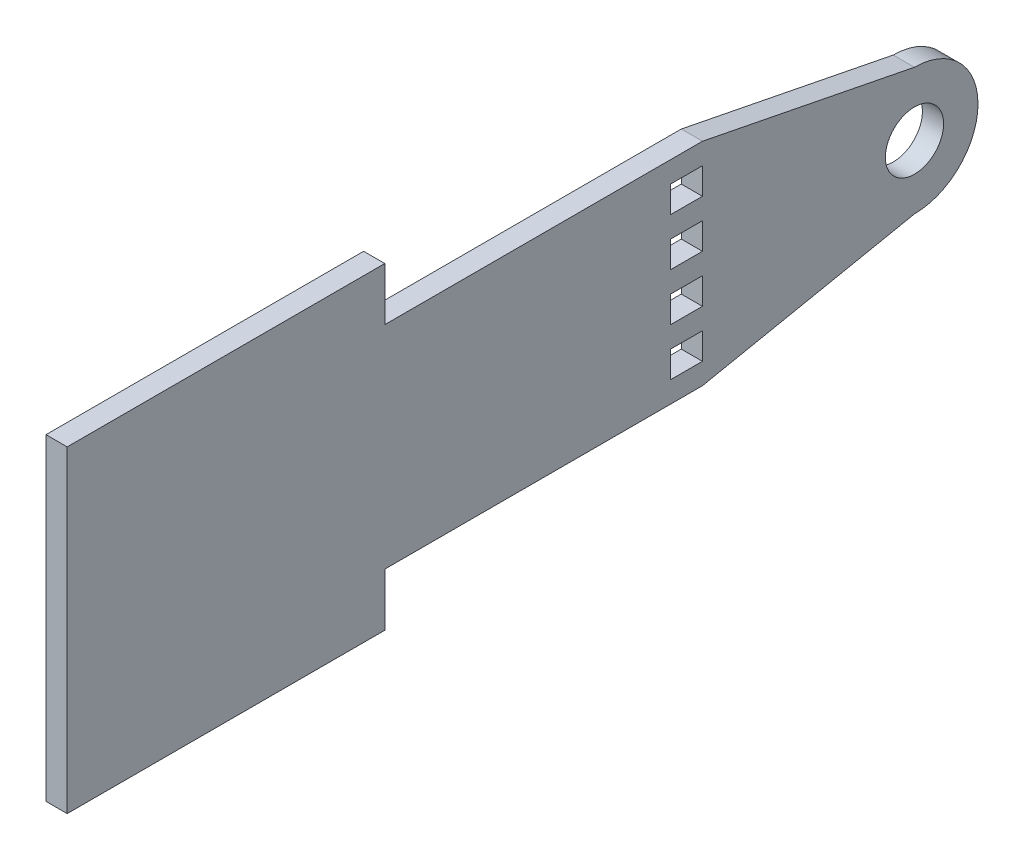
ISO-10303-21;
HEADER;
FILE_DESCRIPTION(('STEP AP214'),'2;1');
FILE_NAME('part.step','',(''),(''),'','','');
FILE_SCHEMA(('AUTOMOTIVE_DESIGN { 1 0 10303 214 1 1 1 1 }'));
ENDSEC;
DATA;
#1=APPLICATION_CONTEXT('core data for automotive mechanical design processes');
#2=APPLICATION_PROTOCOL_DEFINITION('international standard','automotive_design',2000,#1);
#3=PRODUCT_CONTEXT('',#1,'mechanical');
#4=PRODUCT('Part','Part','',(#3));
#5=PRODUCT_RELATED_PRODUCT_CATEGORY('part','',(#4));
#6=PRODUCT_DEFINITION_FORMATION('','',#4);
#7=PRODUCT_DEFINITION_CONTEXT('part definition',#1,'design');
#8=PRODUCT_DEFINITION('design','',#6,#7);
#9=PRODUCT_DEFINITION_SHAPE('','',#8);
#10=(LENGTH_UNIT() NAMED_UNIT(*) SI_UNIT(.MILLI.,.METRE.));
#11=(NAMED_UNIT(*) PLANE_ANGLE_UNIT() SI_UNIT($,.RADIAN.));
#12=(NAMED_UNIT(*) SI_UNIT($,.STERADIAN.) SOLID_ANGLE_UNIT());
#13=UNCERTAINTY_MEASURE_WITH_UNIT(LENGTH_MEASURE(1.E-05),#10,'distance_accuracy_value','');
#14=(GEOMETRIC_REPRESENTATION_CONTEXT(3) GLOBAL_UNCERTAINTY_ASSIGNED_CONTEXT((#13)) GLOBAL_UNIT_ASSIGNED_CONTEXT((#10,
#11,#12)) REPRESENTATION_CONTEXT('',''));
#15=CARTESIAN_POINT('',(0.,0.,0.));
#16=DIRECTION('',(0.,0.,1.));
#17=DIRECTION('',(1.,0.,0.));
#18=AXIS2_PLACEMENT_3D('',#15,#16,#17);
#19=CARTESIAN_POINT('',(2.,0.0415723815960552,-50.0283058298297));
#20=DIRECTION('',(1.,0.,0.));
#21=DIRECTION('',(0.,0.,-1.));
#22=AXIS2_PLACEMENT_3D('',#19,#20,#21);
#23=PLANE('',#22);
#24=DIRECTION('',(0.,0.,1.));
#25=VECTOR('',#24,1.);
#26=CARTESIAN_POINT('',(2.,8.,-27.));
#27=LINE('',#26,#25);
#28=CARTESIAN_POINT('',(2.,8.,-30.));
#29=VERTEX_POINT('',#28);
#30=CARTESIAN_POINT('',(2.,8.,-27.));
#31=VERTEX_POINT('',#30);
#32=EDGE_CURVE('E214',#29,#31,#27,.T.);
#33=ORIENTED_EDGE('',*,*,#32,.F.);
#34=DIRECTION('',(0.,1.,0.));
#35=VECTOR('',#34,1.);
#36=CARTESIAN_POINT('',(2.,8.,-30.));
#37=LINE('',#36,#35);
#38=CARTESIAN_POINT('',(2.,5.50000000000001,-30.));
#39=VERTEX_POINT('',#38);
#40=EDGE_CURVE('E206',#39,#29,#37,.T.);
#41=ORIENTED_EDGE('',*,*,#40,.F.);
#42=DIRECTION('',(0.,0.,-1.));
#43=VECTOR('',#42,1.);
#44=CARTESIAN_POINT('',(2.,5.50000000000001,-30.));
#45=LINE('',#44,#43);
#46=CARTESIAN_POINT('',(2.,5.5,-27.));
#47=VERTEX_POINT('',#46);
#48=EDGE_CURVE('E229',#47,#39,#45,.T.);
#49=ORIENTED_EDGE('',*,*,#48,.F.);
#50=DIRECTION('',(0.,-1.,0.));
#51=VECTOR('',#50,1.);
#52=CARTESIAN_POINT('',(2.,5.5,-27.));
#53=LINE('',#52,#51);
#54=EDGE_CURVE('E227',#31,#47,#53,.T.);
#55=ORIENTED_EDGE('',*,*,#54,.F.);
#56=EDGE_LOOP('',(#33,#41,#49,#55));
#57=FACE_BOUND('',#56,.T.);
#58=DIRECTION('',(0.,0.,1.));
#59=VECTOR('',#58,1.);
#60=CARTESIAN_POINT('',(2.,3.5,-27.));
#61=LINE('',#60,#59);
#62=CARTESIAN_POINT('',(2.,3.5,-30.));
#63=VERTEX_POINT('',#62);
#64=CARTESIAN_POINT('',(2.,3.5,-27.));
#65=VERTEX_POINT('',#64);
#66=EDGE_CURVE('E247',#63,#65,#61,.T.);
#67=ORIENTED_EDGE('',*,*,#66,.F.);
#68=DIRECTION('',(0.,1.,0.));
#69=VECTOR('',#68,1.);
#70=CARTESIAN_POINT('',(2.,3.5,-30.));
#71=LINE('',#70,#69);
#72=CARTESIAN_POINT('',(2.,1.,-30.));
#73=VERTEX_POINT('',#72);
#74=EDGE_CURVE('E245',#73,#63,#71,.T.);
#75=ORIENTED_EDGE('',*,*,#74,.F.);
#76=DIRECTION('',(0.,0.,-1.));
#77=VECTOR('',#76,1.);
#78=CARTESIAN_POINT('',(2.,1.,-30.));
#79=LINE('',#78,#77);
#80=CARTESIAN_POINT('',(2.,1.,-27.));
#81=VERTEX_POINT('',#80);
#82=EDGE_CURVE('E253',#81,#73,#79,.T.);
#83=ORIENTED_EDGE('',*,*,#82,.F.);
#84=DIRECTION('',(0.,-1.,0.));
#85=VECTOR('',#84,1.);
#86=CARTESIAN_POINT('',(2.,1.,-27.));
#87=LINE('',#86,#85);
#88=EDGE_CURVE('E250',#65,#81,#87,.T.);
#89=ORIENTED_EDGE('',*,*,#88,.F.);
#90=EDGE_LOOP('',(#67,#75,#83,#89));
#91=FACE_BOUND('',#90,.T.);
#92=DIRECTION('',(0.,0.,1.));
#93=VECTOR('',#92,1.);
#94=CARTESIAN_POINT('',(2.,-1.,-27.));
#95=LINE('',#94,#93);
#96=CARTESIAN_POINT('',(2.,-1.,-30.));
#97=VERTEX_POINT('',#96);
#98=CARTESIAN_POINT('',(2.,-1.,-27.));
#99=VERTEX_POINT('',#98);
#100=EDGE_CURVE('E278',#97,#99,#95,.T.);
#101=ORIENTED_EDGE('',*,*,#100,.F.);
#102=DIRECTION('',(0.,1.,0.));
#103=VECTOR('',#102,1.);
#104=CARTESIAN_POINT('',(2.,-1.,-30.));
#105=LINE('',#104,#103);
#106=CARTESIAN_POINT('',(2.,-3.5,-30.));
#107=VERTEX_POINT('',#106);
#108=EDGE_CURVE('E276',#107,#97,#105,.T.);
#109=ORIENTED_EDGE('',*,*,#108,.F.);
#110=DIRECTION('',(0.,0.,-1.));
#111=VECTOR('',#110,1.);
#112=CARTESIAN_POINT('',(2.,-3.5,-30.));
#113=LINE('',#112,#111);
#114=CARTESIAN_POINT('',(2.,-3.5,-27.));
#115=VERTEX_POINT('',#114);
#116=EDGE_CURVE('E284',#115,#107,#113,.T.);
#117=ORIENTED_EDGE('',*,*,#116,.F.);
#118=DIRECTION('',(0.,-1.,0.));
#119=VECTOR('',#118,1.);
#120=CARTESIAN_POINT('',(2.,-3.5,-27.));
#121=LINE('',#120,#119);
#122=EDGE_CURVE('E281',#99,#115,#121,.T.);
#123=ORIENTED_EDGE('',*,*,#122,.F.);
#124=EDGE_LOOP('',(#101,#109,#117,#123));
#125=FACE_BOUND('',#124,.T.);
#126=DIRECTION('',(0.,1.,0.));
#127=VECTOR('',#126,1.);
#128=CARTESIAN_POINT('',(2.,-5.5,-30.));
#129=LINE('',#128,#127);
#130=CARTESIAN_POINT('',(2.,-8.,-30.));
#131=VERTEX_POINT('',#130);
#132=CARTESIAN_POINT('',(2.,-5.5,-30.));
#133=VERTEX_POINT('',#132);
#134=EDGE_CURVE('E309',#131,#133,#129,.T.);
#135=ORIENTED_EDGE('',*,*,#134,.F.);
#136=DIRECTION('',(0.,0.,-1.));
#137=VECTOR('',#136,1.);
#138=CARTESIAN_POINT('',(2.,-8.,-30.));
#139=LINE('',#138,#137);
#140=CARTESIAN_POINT('',(2.,-8.,-27.));
#141=VERTEX_POINT('',#140);
#142=EDGE_CURVE('E307',#141,#131,#139,.T.);
#143=ORIENTED_EDGE('',*,*,#142,.F.);
#144=DIRECTION('',(0.,-1.,0.));
#145=VECTOR('',#144,1.);
#146=CARTESIAN_POINT('',(2.,-8.,-27.));
#147=LINE('',#146,#145);
#148=CARTESIAN_POINT('',(2.,-5.5,-27.));
#149=VERTEX_POINT('',#148);
#150=EDGE_CURVE('E315',#149,#141,#147,.T.);
#151=ORIENTED_EDGE('',*,*,#150,.F.);
#152=DIRECTION('',(0.,0.,1.));
#153=VECTOR('',#152,1.);
#154=CARTESIAN_POINT('',(2.,-5.5,-27.));
#155=LINE('',#154,#153);
#156=EDGE_CURVE('E312',#133,#149,#155,.T.);
#157=ORIENTED_EDGE('',*,*,#156,.F.);
#158=EDGE_LOOP('',(#135,#143,#151,#157));
#159=FACE_BOUND('',#158,.T.);
#160=DIRECTION('',(0.,0.19389102891335,0.981023072566044));
#161=VECTOR('',#160,1.);
#162=CARTESIAN_POINT('',(2.,6.04157238159606,-50.0283058298297));
#163=LINE('',#162,#161);
#164=CARTESIAN_POINT('',(2.,6.04157238159606,-50.0283058298297));
#165=VERTEX_POINT('',#164);
#166=CARTESIAN_POINT('',(2.,10.,-30.));
#167=VERTEX_POINT('',#166);
#168=EDGE_CURVE('E338',#165,#167,#163,.T.);
#169=ORIENTED_EDGE('',*,*,#168,.T.);
#170=DIRECTION('',(0.,0.,1.));
#171=VECTOR('',#170,1.);
#172=CARTESIAN_POINT('',(2.,10.,-30.));
#173=LINE('',#172,#171);
#174=CARTESIAN_POINT('',(2.,10.,0.));
#175=VERTEX_POINT('',#174);
#176=EDGE_CURVE('E341',#167,#175,#173,.T.);
#177=ORIENTED_EDGE('',*,*,#176,.T.);
#178=DIRECTION('',(0.,1.,0.));
#179=VECTOR('',#178,1.);
#180=CARTESIAN_POINT('',(2.,10.,0.));
#181=LINE('',#180,#179);
#182=CARTESIAN_POINT('',(2.,15.,0.));
#183=VERTEX_POINT('',#182);
#184=EDGE_CURVE('E344',#175,#183,#181,.T.);
#185=ORIENTED_EDGE('',*,*,#184,.T.);
#186=DIRECTION('',(0.,0.,1.));
#187=VECTOR('',#186,1.);
#188=CARTESIAN_POINT('',(2.,15.,0.));
#189=LINE('',#188,#187);
#190=CARTESIAN_POINT('',(2.,15.,30.));
#191=VERTEX_POINT('',#190);
#192=EDGE_CURVE('E346',#183,#191,#189,.T.);
#193=ORIENTED_EDGE('',*,*,#192,.T.);
#194=DIRECTION('',(0.,-1.,0.));
#195=VECTOR('',#194,1.);
#196=CARTESIAN_POINT('',(2.,15.,30.));
#197=LINE('',#196,#195);
#198=CARTESIAN_POINT('',(2.,-15.,30.));
#199=VERTEX_POINT('',#198);
#200=EDGE_CURVE('E348',#191,#199,#197,.T.);
#201=ORIENTED_EDGE('',*,*,#200,.T.);
#202=DIRECTION('',(0.,0.,-1.));
#203=VECTOR('',#202,1.);
#204=CARTESIAN_POINT('',(2.,-15.,30.));
#205=LINE('',#204,#203);
#206=CARTESIAN_POINT('',(2.,-15.,0.));
#207=VERTEX_POINT('',#206);
#208=EDGE_CURVE('E350',#199,#207,#205,.T.);
#209=ORIENTED_EDGE('',*,*,#208,.T.);
#210=DIRECTION('',(0.,1.,0.));
#211=VECTOR('',#210,1.);
#212=CARTESIAN_POINT('',(2.,-15.,0.));
#213=LINE('',#212,#211);
#214=CARTESIAN_POINT('',(2.,-10.,0.));
#215=VERTEX_POINT('',#214);
#216=EDGE_CURVE('E352',#207,#215,#213,.T.);
#217=ORIENTED_EDGE('',*,*,#216,.T.);
#218=DIRECTION('',(0.,0.,-1.));
#219=VECTOR('',#218,1.);
#220=CARTESIAN_POINT('',(2.,-10.,0.));
#221=LINE('',#220,#219);
#222=CARTESIAN_POINT('',(2.,-10.,-30.));
#223=VERTEX_POINT('',#222);
#224=EDGE_CURVE('E354',#215,#223,#221,.T.);
#225=ORIENTED_EDGE('',*,*,#224,.T.);
#226=DIRECTION('',(0.,0.197805839240745,-0.980241220293385));
#227=VECTOR('',#226,1.);
#228=CARTESIAN_POINT('',(2.,-5.95842761840395,-50.0283058298297));
#229=LINE('',#228,#227);
#230=CARTESIAN_POINT('',(2.,-5.95842761840395,-50.0283058298297));
#231=VERTEX_POINT('',#230);
#232=EDGE_CURVE('E356',#223,#231,#229,.T.);
#233=ORIENTED_EDGE('',*,*,#232,.T.);
#234=CARTESIAN_POINT('',(2.,0.0415723815960552,-50.0283058298297));
#235=DIRECTION('',(1.,0.,0.));
#236=DIRECTION('',(0.,0.,-1.));
#237=AXIS2_PLACEMENT_3D('',#234,#235,#236);
#238=CIRCLE('',#237,6.);
#239=EDGE_CURVE('E358',#231,#165,#238,.T.);
#240=ORIENTED_EDGE('',*,*,#239,.T.);
#241=EDGE_LOOP('',(#169,#177,#185,#193,#201,#209,#217,#225,#233,#240));
#242=FACE_BOUND('',#241,.T.);
#243=CARTESIAN_POINT('',(2.,0.0415723815960552,-50.0283058298297));
#244=DIRECTION('',(1.,0.,0.));
#245=DIRECTION('',(0.,0.,-1.));
#246=AXIS2_PLACEMENT_3D('',#243,#244,#245);
#247=CIRCLE('',#246,2.75);
#248=CARTESIAN_POINT('',(2.,0.0415723815960552,-52.7783058298297));
#249=VERTEX_POINT('',#248);
#250=EDGE_CURVE('E235',#249,#249,#247,.T.);
#251=ORIENTED_EDGE('',*,*,#250,.F.);
#252=EDGE_LOOP('',(#251));
#253=FACE_BOUND('',#252,.T.);
#254=ADVANCED_FACE('F33',(#57,#91,#125,#159,#242,#253),#23,.T.);
#255=CARTESIAN_POINT('',(0.,0.0415723815960552,-50.0283058298297));
#256=DIRECTION('',(1.,0.,0.));
#257=DIRECTION('',(0.,0.,-1.));
#258=AXIS2_PLACEMENT_3D('',#255,#256,#257);
#259=PLANE('',#258);
#260=DIRECTION('',(0.,1.,0.));
#261=VECTOR('',#260,1.);
#262=CARTESIAN_POINT('',(0.,3.5,-30.));
#263=LINE('',#262,#261);
#264=CARTESIAN_POINT('',(0.,1.,-30.));
#265=VERTEX_POINT('',#264);
#266=CARTESIAN_POINT('',(0.,3.5,-30.));
#267=VERTEX_POINT('',#266);
#268=EDGE_CURVE('E222',#265,#267,#263,.T.);
#269=ORIENTED_EDGE('',*,*,#268,.T.);
#270=DIRECTION('',(0.,0.,1.));
#271=VECTOR('',#270,1.);
#272=CARTESIAN_POINT('',(0.,3.5,-27.));
#273=LINE('',#272,#271);
#274=CARTESIAN_POINT('',(0.,3.5,-27.));
#275=VERTEX_POINT('',#274);
#276=EDGE_CURVE('E258',#267,#275,#273,.T.);
#277=ORIENTED_EDGE('',*,*,#276,.T.);
#278=DIRECTION('',(0.,-1.,0.));
#279=VECTOR('',#278,1.);
#280=CARTESIAN_POINT('',(0.,1.,-27.));
#281=LINE('',#280,#279);
#282=CARTESIAN_POINT('',(0.,1.,-27.));
#283=VERTEX_POINT('',#282);
#284=EDGE_CURVE('E261',#275,#283,#281,.T.);
#285=ORIENTED_EDGE('',*,*,#284,.T.);
#286=DIRECTION('',(0.,0.,-1.));
#287=VECTOR('',#286,1.);
#288=CARTESIAN_POINT('',(0.,1.,-30.));
#289=LINE('',#288,#287);
#290=EDGE_CURVE('E248',#283,#265,#289,.T.);
#291=ORIENTED_EDGE('',*,*,#290,.T.);
#292=EDGE_LOOP('',(#269,#277,#285,#291));
#293=FACE_BOUND('',#292,.T.);
#294=DIRECTION('',(0.,0.,-1.));
#295=VECTOR('',#294,1.);
#296=CARTESIAN_POINT('',(0.,-8.,-30.));
#297=LINE('',#296,#295);
#298=CARTESIAN_POINT('',(0.,-8.,-27.));
#299=VERTEX_POINT('',#298);
#300=CARTESIAN_POINT('',(0.,-8.,-30.));
#301=VERTEX_POINT('',#300);
#302=EDGE_CURVE('E306',#299,#301,#297,.T.);
#303=ORIENTED_EDGE('',*,*,#302,.T.);
#304=DIRECTION('',(0.,1.,0.));
#305=VECTOR('',#304,1.);
#306=CARTESIAN_POINT('',(0.,-5.5,-30.));
#307=LINE('',#306,#305);
#308=CARTESIAN_POINT('',(0.,-5.5,-30.));
#309=VERTEX_POINT('',#308);
#310=EDGE_CURVE('E320',#301,#309,#307,.T.);
#311=ORIENTED_EDGE('',*,*,#310,.T.);
#312=DIRECTION('',(0.,0.,1.));
#313=VECTOR('',#312,1.);
#314=CARTESIAN_POINT('',(0.,-5.5,-27.));
#315=LINE('',#314,#313);
#316=CARTESIAN_POINT('',(0.,-5.5,-27.));
#317=VERTEX_POINT('',#316);
#318=EDGE_CURVE('E323',#309,#317,#315,.T.);
#319=ORIENTED_EDGE('',*,*,#318,.T.);
#320=DIRECTION('',(0.,-1.,0.));
#321=VECTOR('',#320,1.);
#322=CARTESIAN_POINT('',(0.,-8.,-27.));
#323=LINE('',#322,#321);
#324=EDGE_CURVE('E310',#317,#299,#323,.T.);
#325=ORIENTED_EDGE('',*,*,#324,.T.);
#326=EDGE_LOOP('',(#303,#311,#319,#325));
#327=FACE_BOUND('',#326,.T.);
#328=DIRECTION('',(0.,0.19389102891335,0.981023072566044));
#329=VECTOR('',#328,1.);
#330=CARTESIAN_POINT('',(0.,6.04157238159606,-50.0283058298297));
#331=LINE('',#330,#329);
#332=CARTESIAN_POINT('',(0.,6.04157238159606,-50.0283058298297));
#333=VERTEX_POINT('',#332);
#334=CARTESIAN_POINT('',(0.,10.,-30.));
#335=VERTEX_POINT('',#334);
#336=EDGE_CURVE('E337',#333,#335,#331,.T.);
#337=ORIENTED_EDGE('',*,*,#336,.F.);
#338=CARTESIAN_POINT('',(0.,0.0415723815960552,-50.0283058298297));
#339=DIRECTION('',(1.,0.,0.));
#340=DIRECTION('',(0.,0.,-1.));
#341=AXIS2_PLACEMENT_3D('',#338,#339,#340);
#342=CIRCLE('',#341,6.);
#343=CARTESIAN_POINT('',(0.,-5.95842761840395,-50.0283058298297));
#344=VERTEX_POINT('',#343);
#345=EDGE_CURVE('E342',#344,#333,#342,.T.);
#346=ORIENTED_EDGE('',*,*,#345,.F.);
#347=DIRECTION('',(0.,0.197805839240745,-0.980241220293385));
#348=VECTOR('',#347,1.);
#349=CARTESIAN_POINT('',(0.,-5.95842761840395,-50.0283058298297));
#350=LINE('',#349,#348);
#351=CARTESIAN_POINT('',(0.,-10.,-30.));
#352=VERTEX_POINT('',#351);
#353=EDGE_CURVE('E377',#352,#344,#350,.T.);
#354=ORIENTED_EDGE('',*,*,#353,.F.);
#355=DIRECTION('',(0.,0.,-1.));
#356=VECTOR('',#355,1.);
#357=CARTESIAN_POINT('',(0.,-10.,0.));
#358=LINE('',#357,#356);
#359=CARTESIAN_POINT('',(0.,-10.,0.));
#360=VERTEX_POINT('',#359);
#361=EDGE_CURVE('E375',#360,#352,#358,.T.);
#362=ORIENTED_EDGE('',*,*,#361,.F.);
#363=DIRECTION('',(0.,1.,0.));
#364=VECTOR('',#363,1.);
#365=CARTESIAN_POINT('',(0.,-15.,0.));
#366=LINE('',#365,#364);
#367=CARTESIAN_POINT('',(0.,-15.,0.));
#368=VERTEX_POINT('',#367);
#369=EDGE_CURVE('E373',#368,#360,#366,.T.);
#370=ORIENTED_EDGE('',*,*,#369,.F.);
#371=DIRECTION('',(0.,0.,-1.));
#372=VECTOR('',#371,1.);
#373=CARTESIAN_POINT('',(0.,-15.,30.));
#374=LINE('',#373,#372);
#375=CARTESIAN_POINT('',(0.,-15.,30.));
#376=VERTEX_POINT('',#375);
#377=EDGE_CURVE('E371',#376,#368,#374,.T.);
#378=ORIENTED_EDGE('',*,*,#377,.F.);
#379=DIRECTION('',(0.,-1.,0.));
#380=VECTOR('',#379,1.);
#381=CARTESIAN_POINT('',(0.,15.,30.));
#382=LINE('',#381,#380);
#383=CARTESIAN_POINT('',(0.,15.,30.));
#384=VERTEX_POINT('',#383);
#385=EDGE_CURVE('E369',#384,#376,#382,.T.);
#386=ORIENTED_EDGE('',*,*,#385,.F.);
#387=DIRECTION('',(0.,0.,1.));
#388=VECTOR('',#387,1.);
#389=CARTESIAN_POINT('',(0.,15.,0.));
#390=LINE('',#389,#388);
#391=CARTESIAN_POINT('',(0.,15.,0.));
#392=VERTEX_POINT('',#391);
#393=EDGE_CURVE('E367',#392,#384,#390,.T.);
#394=ORIENTED_EDGE('',*,*,#393,.F.);
#395=DIRECTION('',(0.,1.,0.));
#396=VECTOR('',#395,1.);
#397=CARTESIAN_POINT('',(0.,10.,0.));
#398=LINE('',#397,#396);
#399=CARTESIAN_POINT('',(0.,10.,0.));
#400=VERTEX_POINT('',#399);
#401=EDGE_CURVE('E365',#400,#392,#398,.T.);
#402=ORIENTED_EDGE('',*,*,#401,.F.);
#403=DIRECTION('',(0.,0.,1.));
#404=VECTOR('',#403,1.);
#405=CARTESIAN_POINT('',(0.,10.,-30.));
#406=LINE('',#405,#404);
#407=EDGE_CURVE('E363',#335,#400,#406,.T.);
#408=ORIENTED_EDGE('',*,*,#407,.F.);
#409=EDGE_LOOP('',(#337,#346,#354,#362,#370,#378,#386,#394,#402,#408));
#410=FACE_BOUND('',#409,.T.);
#411=DIRECTION('',(0.,1.,0.));
#412=VECTOR('',#411,1.);
#413=CARTESIAN_POINT('',(0.,-1.,-30.));
#414=LINE('',#413,#412);
#415=CARTESIAN_POINT('',(0.,-3.5,-30.));
#416=VERTEX_POINT('',#415);
#417=CARTESIAN_POINT('',(0.,-1.,-30.));
#418=VERTEX_POINT('',#417);
#419=EDGE_CURVE('E275',#416,#418,#414,.T.);
#420=ORIENTED_EDGE('',*,*,#419,.T.);
#421=DIRECTION('',(0.,0.,1.));
#422=VECTOR('',#421,1.);
#423=CARTESIAN_POINT('',(0.,-1.,-27.));
#424=LINE('',#423,#422);
#425=CARTESIAN_POINT('',(0.,-1.,-27.));
#426=VERTEX_POINT('',#425);
#427=EDGE_CURVE('E289',#418,#426,#424,.T.);
#428=ORIENTED_EDGE('',*,*,#427,.T.);
#429=DIRECTION('',(0.,-1.,0.));
#430=VECTOR('',#429,1.);
#431=CARTESIAN_POINT('',(0.,-3.5,-27.));
#432=LINE('',#431,#430);
#433=CARTESIAN_POINT('',(0.,-3.5,-27.));
#434=VERTEX_POINT('',#433);
#435=EDGE_CURVE('E292',#426,#434,#432,.T.);
#436=ORIENTED_EDGE('',*,*,#435,.T.);
#437=DIRECTION('',(0.,0.,-1.));
#438=VECTOR('',#437,1.);
#439=CARTESIAN_POINT('',(0.,-3.5,-30.));
#440=LINE('',#439,#438);
#441=EDGE_CURVE('E279',#434,#416,#440,.T.);
#442=ORIENTED_EDGE('',*,*,#441,.T.);
#443=EDGE_LOOP('',(#420,#428,#436,#442));
#444=FACE_BOUND('',#443,.T.);
#445=DIRECTION('',(0.,1.,0.));
#446=VECTOR('',#445,1.);
#447=CARTESIAN_POINT('',(0.,8.,-30.));
#448=LINE('',#447,#446);
#449=CARTESIAN_POINT('',(0.,5.50000000000001,-30.));
#450=VERTEX_POINT('',#449);
#451=CARTESIAN_POINT('',(0.,8.,-30.));
#452=VERTEX_POINT('',#451);
#453=EDGE_CURVE('E56',#450,#452,#448,.T.);
#454=ORIENTED_EDGE('',*,*,#453,.T.);
#455=DIRECTION('',(0.,0.,1.));
#456=VECTOR('',#455,1.);
#457=CARTESIAN_POINT('',(0.,8.,-27.));
#458=LINE('',#457,#456);
#459=CARTESIAN_POINT('',(0.,8.,-27.));
#460=VERTEX_POINT('',#459);
#461=EDGE_CURVE('E221',#452,#460,#458,.T.);
#462=ORIENTED_EDGE('',*,*,#461,.T.);
#463=DIRECTION('',(0.,-1.,0.));
#464=VECTOR('',#463,1.);
#465=CARTESIAN_POINT('',(0.,5.5,-27.));
#466=LINE('',#465,#464);
#467=CARTESIAN_POINT('',(0.,5.5,-27.));
#468=VERTEX_POINT('',#467);
#469=EDGE_CURVE('E237',#460,#468,#466,.T.);
#470=ORIENTED_EDGE('',*,*,#469,.T.);
#471=DIRECTION('',(0.,0.,-1.));
#472=VECTOR('',#471,1.);
#473=CARTESIAN_POINT('',(0.,5.50000000000001,-30.));
#474=LINE('',#473,#472);
#475=EDGE_CURVE('E215',#468,#450,#474,.T.);
#476=ORIENTED_EDGE('',*,*,#475,.T.);
#477=EDGE_LOOP('',(#454,#462,#470,#476));
#478=FACE_BOUND('',#477,.T.);
#479=CARTESIAN_POINT('',(0.,0.0415723815960552,-50.0283058298297));
#480=DIRECTION('',(1.,0.,0.));
#481=DIRECTION('',(0.,0.,-1.));
#482=AXIS2_PLACEMENT_3D('',#479,#480,#481);
#483=CIRCLE('',#482,2.75);
#484=CARTESIAN_POINT('',(0.,0.0415723815960552,-52.7783058298297));
#485=VERTEX_POINT('',#484);
#486=EDGE_CURVE('E720',#485,#485,#483,.T.);
#487=ORIENTED_EDGE('',*,*,#486,.T.);
#488=EDGE_LOOP('',(#487));
#489=FACE_BOUND('',#488,.T.);
#490=ADVANCED_FACE('F413',(#293,#327,#410,#444,#478,#489),#259,.F.);
#491=CARTESIAN_POINT('',(2.,6.04157238159606,-50.0283058298297));
#492=DIRECTION('',(0.,-0.981023072566044,0.19389102891335));
#493=DIRECTION('',(0.,-0.19389102891335,-0.981023072566044));
#494=AXIS2_PLACEMENT_3D('',#491,#492,#493);
#495=PLANE('',#494);
#496=ORIENTED_EDGE('',*,*,#336,.T.);
#497=DIRECTION('',(-1.,0.,0.));
#498=VECTOR('',#497,1.);
#499=CARTESIAN_POINT('',(2.,10.,-30.));
#500=LINE('',#499,#498);
#501=EDGE_CURVE('E11',#167,#335,#500,.T.);
#502=ORIENTED_EDGE('',*,*,#501,.F.);
#503=ORIENTED_EDGE('',*,*,#168,.F.);
#504=DIRECTION('',(-1.,0.,0.));
#505=VECTOR('',#504,1.);
#506=CARTESIAN_POINT('',(2.,6.04157238159606,-50.0283058298297));
#507=LINE('',#506,#505);
#508=EDGE_CURVE('E360',#165,#333,#507,.T.);
#509=ORIENTED_EDGE('',*,*,#508,.T.);
#510=EDGE_LOOP('',(#496,#502,#503,#509));
#511=FACE_BOUND('',#510,.T.);
#512=ADVANCED_FACE('F35',(#511),#495,.F.);
#513=CARTESIAN_POINT('',(2.,10.,-30.));
#514=DIRECTION('',(0.,-1.,0.));
#515=DIRECTION('',(0.,0.,-1.));
#516=AXIS2_PLACEMENT_3D('',#513,#514,#515);
#517=PLANE('',#516);
#518=ORIENTED_EDGE('',*,*,#407,.T.);
#519=DIRECTION('',(-1.,0.,0.));
#520=VECTOR('',#519,1.);
#521=CARTESIAN_POINT('',(2.,10.,0.));
#522=LINE('',#521,#520);
#523=EDGE_CURVE('E41',#175,#400,#522,.T.);
#524=ORIENTED_EDGE('',*,*,#523,.F.);
#525=ORIENTED_EDGE('',*,*,#176,.F.);
#526=ORIENTED_EDGE('',*,*,#501,.T.);
#527=EDGE_LOOP('',(#518,#524,#525,#526));
#528=FACE_BOUND('',#527,.T.);
#529=ADVANCED_FACE('F431',(#528),#517,.F.);
#530=CARTESIAN_POINT('',(2.,10.,0.));
#531=DIRECTION('',(0.,0.,1.));
#532=DIRECTION('',(1.,0.,0.));
#533=AXIS2_PLACEMENT_3D('',#530,#531,#532);
#534=PLANE('',#533);
#535=ORIENTED_EDGE('',*,*,#401,.T.);
#536=DIRECTION('',(-1.,0.,0.));
#537=VECTOR('',#536,1.);
#538=CARTESIAN_POINT('',(2.,15.,0.));
#539=LINE('',#538,#537);
#540=EDGE_CURVE('E400',#183,#392,#539,.T.);
#541=ORIENTED_EDGE('',*,*,#540,.F.);
#542=ORIENTED_EDGE('',*,*,#184,.F.);
#543=ORIENTED_EDGE('',*,*,#523,.T.);
#544=EDGE_LOOP('',(#535,#541,#542,#543));
#545=FACE_BOUND('',#544,.T.);
#546=ADVANCED_FACE('F407',(#545),#534,.F.);
#547=CARTESIAN_POINT('',(2.,15.,0.));
#548=DIRECTION('',(0.,-1.,0.));
#549=DIRECTION('',(0.,0.,-1.));
#550=AXIS2_PLACEMENT_3D('',#547,#548,#549);
#551=PLANE('',#550);
#552=ORIENTED_EDGE('',*,*,#393,.T.);
#553=DIRECTION('',(-1.,0.,0.));
#554=VECTOR('',#553,1.);
#555=CARTESIAN_POINT('',(2.,15.,30.));
#556=LINE('',#555,#554);
#557=EDGE_CURVE('E397',#191,#384,#556,.T.);
#558=ORIENTED_EDGE('',*,*,#557,.F.);
#559=ORIENTED_EDGE('',*,*,#192,.F.);
#560=ORIENTED_EDGE('',*,*,#540,.T.);
#561=EDGE_LOOP('',(#552,#558,#559,#560));
#562=FACE_BOUND('',#561,.T.);
#563=ADVANCED_FACE('F419',(#562),#551,.F.);
#564=CARTESIAN_POINT('',(2.,15.,30.));
#565=DIRECTION('',(0.,0.,-1.));
#566=DIRECTION('',(-1.,0.,0.));
#567=AXIS2_PLACEMENT_3D('',#564,#565,#566);
#568=PLANE('',#567);
#569=ORIENTED_EDGE('',*,*,#385,.T.);
#570=DIRECTION('',(-1.,0.,0.));
#571=VECTOR('',#570,1.);
#572=CARTESIAN_POINT('',(2.,-15.,30.));
#573=LINE('',#572,#571);
#574=EDGE_CURVE('E394',#199,#376,#573,.T.);
#575=ORIENTED_EDGE('',*,*,#574,.F.);
#576=ORIENTED_EDGE('',*,*,#200,.F.);
#577=ORIENTED_EDGE('',*,*,#557,.T.);
#578=EDGE_LOOP('',(#569,#575,#576,#577));
#579=FACE_BOUND('',#578,.T.);
#580=ADVANCED_FACE('F423',(#579),#568,.F.);
#581=CARTESIAN_POINT('',(2.,-15.,30.));
#582=DIRECTION('',(0.,1.,0.));
#583=DIRECTION('',(0.,0.,1.));
#584=AXIS2_PLACEMENT_3D('',#581,#582,#583);
#585=PLANE('',#584);
#586=ORIENTED_EDGE('',*,*,#377,.T.);
#587=DIRECTION('',(-1.,0.,0.));
#588=VECTOR('',#587,1.);
#589=CARTESIAN_POINT('',(2.,-15.,0.));
#590=LINE('',#589,#588);
#591=EDGE_CURVE('E391',#207,#368,#590,.T.);
#592=ORIENTED_EDGE('',*,*,#591,.F.);
#593=ORIENTED_EDGE('',*,*,#208,.F.);
#594=ORIENTED_EDGE('',*,*,#574,.T.);
#595=EDGE_LOOP('',(#586,#592,#593,#594));
#596=FACE_BOUND('',#595,.T.);
#597=ADVANCED_FACE('F454',(#596),#585,.F.);
#598=CARTESIAN_POINT('',(2.,-15.,0.));
#599=DIRECTION('',(0.,0.,1.));
#600=DIRECTION('',(1.,0.,0.));
#601=AXIS2_PLACEMENT_3D('',#598,#599,#600);
#602=PLANE('',#601);
#603=ORIENTED_EDGE('',*,*,#369,.T.);
#604=DIRECTION('',(-1.,0.,0.));
#605=VECTOR('',#604,1.);
#606=CARTESIAN_POINT('',(2.,-10.,0.));
#607=LINE('',#606,#605);
#608=EDGE_CURVE('E388',#215,#360,#607,.T.);
#609=ORIENTED_EDGE('',*,*,#608,.F.);
#610=ORIENTED_EDGE('',*,*,#216,.F.);
#611=ORIENTED_EDGE('',*,*,#591,.T.);
#612=EDGE_LOOP('',(#603,#609,#610,#611));
#613=FACE_BOUND('',#612,.T.);
#614=ADVANCED_FACE('F451',(#613),#602,.F.);
#615=CARTESIAN_POINT('',(2.,-10.,0.));
#616=DIRECTION('',(0.,1.,0.));
#617=DIRECTION('',(0.,0.,1.));
#618=AXIS2_PLACEMENT_3D('',#615,#616,#617);
#619=PLANE('',#618);
#620=ORIENTED_EDGE('',*,*,#361,.T.);
#621=DIRECTION('',(-1.,0.,0.));
#622=VECTOR('',#621,1.);
#623=CARTESIAN_POINT('',(2.,-10.,-30.));
#624=LINE('',#623,#622);
#625=EDGE_CURVE('E385',#223,#352,#624,.T.);
#626=ORIENTED_EDGE('',*,*,#625,.F.);
#627=ORIENTED_EDGE('',*,*,#224,.F.);
#628=ORIENTED_EDGE('',*,*,#608,.T.);
#629=EDGE_LOOP('',(#620,#626,#627,#628));
#630=FACE_BOUND('',#629,.T.);
#631=ADVANCED_FACE('F447',(#630),#619,.F.);
#632=CARTESIAN_POINT('',(2.,-5.95842761840395,-50.0283058298297));
#633=DIRECTION('',(0.,0.980241220293385,0.197805839240745));
#634=DIRECTION('',(0.,-0.197805839240745,0.980241220293385));
#635=AXIS2_PLACEMENT_3D('',#632,#633,#634);
#636=PLANE('',#635);
#637=ORIENTED_EDGE('',*,*,#353,.T.);
#638=DIRECTION('',(-1.,0.,0.));
#639=VECTOR('',#638,1.);
#640=CARTESIAN_POINT('',(2.,-5.95842761840395,-50.0283058298297));
#641=LINE('',#640,#639);
#642=EDGE_CURVE('E382',#231,#344,#641,.T.);
#643=ORIENTED_EDGE('',*,*,#642,.F.);
#644=ORIENTED_EDGE('',*,*,#232,.F.);
#645=ORIENTED_EDGE('',*,*,#625,.T.);
#646=EDGE_LOOP('',(#637,#643,#644,#645));
#647=FACE_BOUND('',#646,.T.);
#648=ADVANCED_FACE('F443',(#647),#636,.F.);
#649=CARTESIAN_POINT('',(2.,0.0415723815960552,-50.0283058298297));
#650=DIRECTION('',(-1.,0.,0.));
#651=DIRECTION('',(0.,0.,1.));
#652=AXIS2_PLACEMENT_3D('',#649,#650,#651);
#653=CYLINDRICAL_SURFACE('',#652,6.);
#654=ORIENTED_EDGE('',*,*,#345,.T.);
#655=ORIENTED_EDGE('',*,*,#508,.F.);
#656=ORIENTED_EDGE('',*,*,#239,.F.);
#657=ORIENTED_EDGE('',*,*,#642,.T.);
#658=EDGE_LOOP('',(#654,#655,#656,#657));
#659=FACE_BOUND('',#658,.T.);
#660=ADVANCED_FACE('F438',(#659),#653,.T.);
#661=CARTESIAN_POINT('',(2.,-8.,-30.));
#662=DIRECTION('',(0.,1.,0.));
#663=DIRECTION('',(0.,0.,1.));
#664=AXIS2_PLACEMENT_3D('',#661,#662,#663);
#665=PLANE('',#664);
#666=ORIENTED_EDGE('',*,*,#302,.F.);
#667=DIRECTION('',(-1.,0.,0.));
#668=VECTOR('',#667,1.);
#669=CARTESIAN_POINT('',(2.,-8.,-27.));
#670=LINE('',#669,#668);
#671=EDGE_CURVE('E317',#141,#299,#670,.T.);
#672=ORIENTED_EDGE('',*,*,#671,.F.);
#673=ORIENTED_EDGE('',*,*,#142,.T.);
#674=DIRECTION('',(-1.,0.,0.));
#675=VECTOR('',#674,1.);
#676=CARTESIAN_POINT('',(2.,-8.,-30.));
#677=LINE('',#676,#675);
#678=EDGE_CURVE('E334',#131,#301,#677,.T.);
#679=ORIENTED_EDGE('',*,*,#678,.T.);
#680=EDGE_LOOP('',(#666,#672,#673,#679));
#681=FACE_BOUND('',#680,.T.);
#682=ADVANCED_FACE('F471',(#681),#665,.T.);
#683=CARTESIAN_POINT('',(2.,-5.5,-30.));
#684=DIRECTION('',(0.,0.,1.));
#685=DIRECTION('',(1.,0.,0.));
#686=AXIS2_PLACEMENT_3D('',#683,#684,#685);
#687=PLANE('',#686);
#688=ORIENTED_EDGE('',*,*,#310,.F.);
#689=ORIENTED_EDGE('',*,*,#678,.F.);
#690=ORIENTED_EDGE('',*,*,#134,.T.);
#691=DIRECTION('',(-1.,0.,0.));
#692=VECTOR('',#691,1.);
#693=CARTESIAN_POINT('',(2.,-5.5,-30.));
#694=LINE('',#693,#692);
#695=EDGE_CURVE('E332',#133,#309,#694,.T.);
#696=ORIENTED_EDGE('',*,*,#695,.T.);
#697=EDGE_LOOP('',(#688,#689,#690,#696));
#698=FACE_BOUND('',#697,.T.);
#699=ADVANCED_FACE('F497',(#698),#687,.T.);
#700=CARTESIAN_POINT('',(2.,-5.5,-27.));
#701=DIRECTION('',(0.,-1.,0.));
#702=DIRECTION('',(0.,0.,-1.));
#703=AXIS2_PLACEMENT_3D('',#700,#701,#702);
#704=PLANE('',#703);
#705=ORIENTED_EDGE('',*,*,#318,.F.);
#706=ORIENTED_EDGE('',*,*,#695,.F.);
#707=ORIENTED_EDGE('',*,*,#156,.T.);
#708=DIRECTION('',(-1.,0.,0.));
#709=VECTOR('',#708,1.);
#710=CARTESIAN_POINT('',(2.,-5.5,-27.));
#711=LINE('',#710,#709);
#712=EDGE_CURVE('E330',#149,#317,#711,.T.);
#713=ORIENTED_EDGE('',*,*,#712,.T.);
#714=EDGE_LOOP('',(#705,#706,#707,#713));
#715=FACE_BOUND('',#714,.T.);
#716=ADVANCED_FACE('F504',(#715),#704,.T.);
#717=CARTESIAN_POINT('',(2.,-8.,-27.));
#718=DIRECTION('',(0.,0.,-1.));
#719=DIRECTION('',(-1.,0.,0.));
#720=AXIS2_PLACEMENT_3D('',#717,#718,#719);
#721=PLANE('',#720);
#722=ORIENTED_EDGE('',*,*,#324,.F.);
#723=ORIENTED_EDGE('',*,*,#712,.F.);
#724=ORIENTED_EDGE('',*,*,#150,.T.);
#725=ORIENTED_EDGE('',*,*,#671,.T.);
#726=EDGE_LOOP('',(#722,#723,#724,#725));
#727=FACE_BOUND('',#726,.T.);
#728=ADVANCED_FACE('F511',(#727),#721,.T.);
#729=CARTESIAN_POINT('',(2.,-1.,-30.));
#730=DIRECTION('',(0.,0.,1.));
#731=DIRECTION('',(1.,0.,0.));
#732=AXIS2_PLACEMENT_3D('',#729,#730,#731);
#733=PLANE('',#732);
#734=ORIENTED_EDGE('',*,*,#419,.F.);
#735=DIRECTION('',(-1.,0.,0.));
#736=VECTOR('',#735,1.);
#737=CARTESIAN_POINT('',(2.,-3.5,-30.));
#738=LINE('',#737,#736);
#739=EDGE_CURVE('E286',#107,#416,#738,.T.);
#740=ORIENTED_EDGE('',*,*,#739,.F.);
#741=ORIENTED_EDGE('',*,*,#108,.T.);
#742=DIRECTION('',(-1.,0.,0.));
#743=VECTOR('',#742,1.);
#744=CARTESIAN_POINT('',(2.,-1.,-30.));
#745=LINE('',#744,#743);
#746=EDGE_CURVE('E303',#97,#418,#745,.T.);
#747=ORIENTED_EDGE('',*,*,#746,.T.);
#748=EDGE_LOOP('',(#734,#740,#741,#747));
#749=FACE_BOUND('',#748,.T.);
#750=ADVANCED_FACE('F519',(#749),#733,.T.);
#751=CARTESIAN_POINT('',(2.,-1.,-27.));
#752=DIRECTION('',(0.,-1.,0.));
#753=DIRECTION('',(0.,0.,-1.));
#754=AXIS2_PLACEMENT_3D('',#751,#752,#753);
#755=PLANE('',#754);
#756=ORIENTED_EDGE('',*,*,#427,.F.);
#757=ORIENTED_EDGE('',*,*,#746,.F.);
#758=ORIENTED_EDGE('',*,*,#100,.T.);
#759=DIRECTION('',(-1.,0.,0.));
#760=VECTOR('',#759,1.);
#761=CARTESIAN_POINT('',(2.,-1.,-27.));
#762=LINE('',#761,#760);
#763=EDGE_CURVE('E301',#99,#426,#762,.T.);
#764=ORIENTED_EDGE('',*,*,#763,.T.);
#765=EDGE_LOOP('',(#756,#757,#758,#764));
#766=FACE_BOUND('',#765,.T.);
#767=ADVANCED_FACE('F527',(#766),#755,.T.);
#768=CARTESIAN_POINT('',(2.,-3.5,-27.));
#769=DIRECTION('',(0.,0.,-1.));
#770=DIRECTION('',(-1.,0.,0.));
#771=AXIS2_PLACEMENT_3D('',#768,#769,#770);
#772=PLANE('',#771);
#773=ORIENTED_EDGE('',*,*,#435,.F.);
#774=ORIENTED_EDGE('',*,*,#763,.F.);
#775=ORIENTED_EDGE('',*,*,#122,.T.);
#776=DIRECTION('',(-1.,0.,0.));
#777=VECTOR('',#776,1.);
#778=CARTESIAN_POINT('',(2.,-3.5,-27.));
#779=LINE('',#778,#777);
#780=EDGE_CURVE('E299',#115,#434,#779,.T.);
#781=ORIENTED_EDGE('',*,*,#780,.T.);
#782=EDGE_LOOP('',(#773,#774,#775,#781));
#783=FACE_BOUND('',#782,.T.);
#784=ADVANCED_FACE('F535',(#783),#772,.T.);
#785=CARTESIAN_POINT('',(2.,-3.5,-30.));
#786=DIRECTION('',(0.,1.,0.));
#787=DIRECTION('',(0.,0.,1.));
#788=AXIS2_PLACEMENT_3D('',#785,#786,#787);
#789=PLANE('',#788);
#790=ORIENTED_EDGE('',*,*,#441,.F.);
#791=ORIENTED_EDGE('',*,*,#780,.F.);
#792=ORIENTED_EDGE('',*,*,#116,.T.);
#793=ORIENTED_EDGE('',*,*,#739,.T.);
#794=EDGE_LOOP('',(#790,#791,#792,#793));
#795=FACE_BOUND('',#794,.T.);
#796=ADVANCED_FACE('F543',(#795),#789,.T.);
#797=CARTESIAN_POINT('',(2.,3.5,-30.));
#798=DIRECTION('',(0.,0.,1.));
#799=DIRECTION('',(1.,0.,0.));
#800=AXIS2_PLACEMENT_3D('',#797,#798,#799);
#801=PLANE('',#800);
#802=ORIENTED_EDGE('',*,*,#268,.F.);
#803=DIRECTION('',(-1.,0.,0.));
#804=VECTOR('',#803,1.);
#805=CARTESIAN_POINT('',(2.,1.,-30.));
#806=LINE('',#805,#804);
#807=EDGE_CURVE('E255',#73,#265,#806,.T.);
#808=ORIENTED_EDGE('',*,*,#807,.F.);
#809=ORIENTED_EDGE('',*,*,#74,.T.);
#810=DIRECTION('',(-1.,0.,0.));
#811=VECTOR('',#810,1.);
#812=CARTESIAN_POINT('',(2.,3.5,-30.));
#813=LINE('',#812,#811);
#814=EDGE_CURVE('E272',#63,#267,#813,.T.);
#815=ORIENTED_EDGE('',*,*,#814,.T.);
#816=EDGE_LOOP('',(#802,#808,#809,#815));
#817=FACE_BOUND('',#816,.T.);
#818=ADVANCED_FACE('F551',(#817),#801,.T.);
#819=CARTESIAN_POINT('',(2.,3.5,-27.));
#820=DIRECTION('',(0.,-1.,0.));
#821=DIRECTION('',(0.,0.,-1.));
#822=AXIS2_PLACEMENT_3D('',#819,#820,#821);
#823=PLANE('',#822);
#824=ORIENTED_EDGE('',*,*,#276,.F.);
#825=ORIENTED_EDGE('',*,*,#814,.F.);
#826=ORIENTED_EDGE('',*,*,#66,.T.);
#827=DIRECTION('',(-1.,0.,0.));
#828=VECTOR('',#827,1.);
#829=CARTESIAN_POINT('',(2.,3.5,-27.));
#830=LINE('',#829,#828);
#831=EDGE_CURVE('E270',#65,#275,#830,.T.);
#832=ORIENTED_EDGE('',*,*,#831,.T.);
#833=EDGE_LOOP('',(#824,#825,#826,#832));
#834=FACE_BOUND('',#833,.T.);
#835=ADVANCED_FACE('F559',(#834),#823,.T.);
#836=CARTESIAN_POINT('',(2.,1.,-27.));
#837=DIRECTION('',(0.,0.,-1.));
#838=DIRECTION('',(-1.,0.,0.));
#839=AXIS2_PLACEMENT_3D('',#836,#837,#838);
#840=PLANE('',#839);
#841=ORIENTED_EDGE('',*,*,#284,.F.);
#842=ORIENTED_EDGE('',*,*,#831,.F.);
#843=ORIENTED_EDGE('',*,*,#88,.T.);
#844=DIRECTION('',(-1.,0.,0.));
#845=VECTOR('',#844,1.);
#846=CARTESIAN_POINT('',(2.,1.,-27.));
#847=LINE('',#846,#845);
#848=EDGE_CURVE('E268',#81,#283,#847,.T.);
#849=ORIENTED_EDGE('',*,*,#848,.T.);
#850=EDGE_LOOP('',(#841,#842,#843,#849));
#851=FACE_BOUND('',#850,.T.);
#852=ADVANCED_FACE('F567',(#851),#840,.T.);
#853=CARTESIAN_POINT('',(2.,1.,-30.));
#854=DIRECTION('',(0.,1.,0.));
#855=DIRECTION('',(0.,0.,1.));
#856=AXIS2_PLACEMENT_3D('',#853,#854,#855);
#857=PLANE('',#856);
#858=ORIENTED_EDGE('',*,*,#290,.F.);
#859=ORIENTED_EDGE('',*,*,#848,.F.);
#860=ORIENTED_EDGE('',*,*,#82,.T.);
#861=ORIENTED_EDGE('',*,*,#807,.T.);
#862=EDGE_LOOP('',(#858,#859,#860,#861));
#863=FACE_BOUND('',#862,.T.);
#864=ADVANCED_FACE('F575',(#863),#857,.T.);
#865=CARTESIAN_POINT('',(2.,8.,-30.));
#866=DIRECTION('',(0.,0.,1.));
#867=DIRECTION('',(1.,0.,0.));
#868=AXIS2_PLACEMENT_3D('',#865,#866,#867);
#869=PLANE('',#868);
#870=ORIENTED_EDGE('',*,*,#453,.F.);
#871=DIRECTION('',(-1.,0.,0.));
#872=VECTOR('',#871,1.);
#873=CARTESIAN_POINT('',(2.,5.50000000000001,-30.));
#874=LINE('',#873,#872);
#875=EDGE_CURVE('E210',#39,#450,#874,.T.);
#876=ORIENTED_EDGE('',*,*,#875,.F.);
#877=ORIENTED_EDGE('',*,*,#40,.T.);
#878=DIRECTION('',(-1.,0.,0.));
#879=VECTOR('',#878,1.);
#880=CARTESIAN_POINT('',(2.,8.,-30.));
#881=LINE('',#880,#879);
#882=EDGE_CURVE('E209',#29,#452,#881,.T.);
#883=ORIENTED_EDGE('',*,*,#882,.T.);
#884=EDGE_LOOP('',(#870,#876,#877,#883));
#885=FACE_BOUND('',#884,.T.);
#886=ADVANCED_FACE('F208',(#885),#869,.T.);
#887=CARTESIAN_POINT('',(2.,8.,-27.));
#888=DIRECTION('',(0.,-1.,0.));
#889=DIRECTION('',(0.,0.,-1.));
#890=AXIS2_PLACEMENT_3D('',#887,#888,#889);
#891=PLANE('',#890);
#892=ORIENTED_EDGE('',*,*,#461,.F.);
#893=ORIENTED_EDGE('',*,*,#882,.F.);
#894=ORIENTED_EDGE('',*,*,#32,.T.);
#895=DIRECTION('',(-1.,0.,0.));
#896=VECTOR('',#895,1.);
#897=CARTESIAN_POINT('',(2.,8.,-27.));
#898=LINE('',#897,#896);
#899=EDGE_CURVE('E223',#31,#460,#898,.T.);
#900=ORIENTED_EDGE('',*,*,#899,.T.);
#901=EDGE_LOOP('',(#892,#893,#894,#900));
#902=FACE_BOUND('',#901,.T.);
#903=ADVANCED_FACE('F218',(#902),#891,.T.);
#904=CARTESIAN_POINT('',(2.,5.5,-27.));
#905=DIRECTION('',(0.,0.,-1.));
#906=DIRECTION('',(-1.,0.,0.));
#907=AXIS2_PLACEMENT_3D('',#904,#905,#906);
#908=PLANE('',#907);
#909=ORIENTED_EDGE('',*,*,#469,.F.);
#910=ORIENTED_EDGE('',*,*,#899,.F.);
#911=ORIENTED_EDGE('',*,*,#54,.T.);
#912=DIRECTION('',(-1.,0.,0.));
#913=VECTOR('',#912,1.);
#914=CARTESIAN_POINT('',(2.,5.5,-27.));
#915=LINE('',#914,#913);
#916=EDGE_CURVE('E48',#47,#468,#915,.T.);
#917=ORIENTED_EDGE('',*,*,#916,.T.);
#918=EDGE_LOOP('',(#909,#910,#911,#917));
#919=FACE_BOUND('',#918,.T.);
#920=ADVANCED_FACE('F596',(#919),#908,.T.);
#921=CARTESIAN_POINT('',(2.,5.50000000000001,-30.));
#922=DIRECTION('',(0.,1.,0.));
#923=DIRECTION('',(0.,0.,1.));
#924=AXIS2_PLACEMENT_3D('',#921,#922,#923);
#925=PLANE('',#924);
#926=ORIENTED_EDGE('',*,*,#475,.F.);
#927=ORIENTED_EDGE('',*,*,#916,.F.);
#928=ORIENTED_EDGE('',*,*,#48,.T.);
#929=ORIENTED_EDGE('',*,*,#875,.T.);
#930=EDGE_LOOP('',(#926,#927,#928,#929));
#931=FACE_BOUND('',#930,.T.);
#932=ADVANCED_FACE('F603',(#931),#925,.T.);
#933=CARTESIAN_POINT('',(2.,0.0415723815960552,-50.0283058298297));
#934=DIRECTION('',(-1.,0.,0.));
#935=DIRECTION('',(0.,0.,1.));
#936=AXIS2_PLACEMENT_3D('',#933,#934,#935);
#937=CYLINDRICAL_SURFACE('',#936,2.75);
#938=ORIENTED_EDGE('',*,*,#250,.T.);
#939=EDGE_LOOP('',(#938));
#940=FACE_BOUND('',#939,.T.);
#941=ORIENTED_EDGE('',*,*,#486,.F.);
#942=EDGE_LOOP('',(#941));
#943=FACE_BOUND('',#942,.T.);
#944=ADVANCED_FACE('F611',(#940,#943),#937,.F.);
#945=CLOSED_SHELL('',(#254,#490,#512,#529,#546,#563,#580,#597,#614,#631,#648,#660,#682,#699,
#716,#728,#750,#767,#784,#796,#818,#835,#852,#864,#886,#903,#920,#932,#944));
#946=MANIFOLD_SOLID_BREP('B2',#945);
#947=ADVANCED_BREP_SHAPE_REPRESENTATION('',(#18,#946),#14);
#948=SHAPE_DEFINITION_REPRESENTATION(#9,#947);
ENDSEC;
END-ISO-10303-21;
